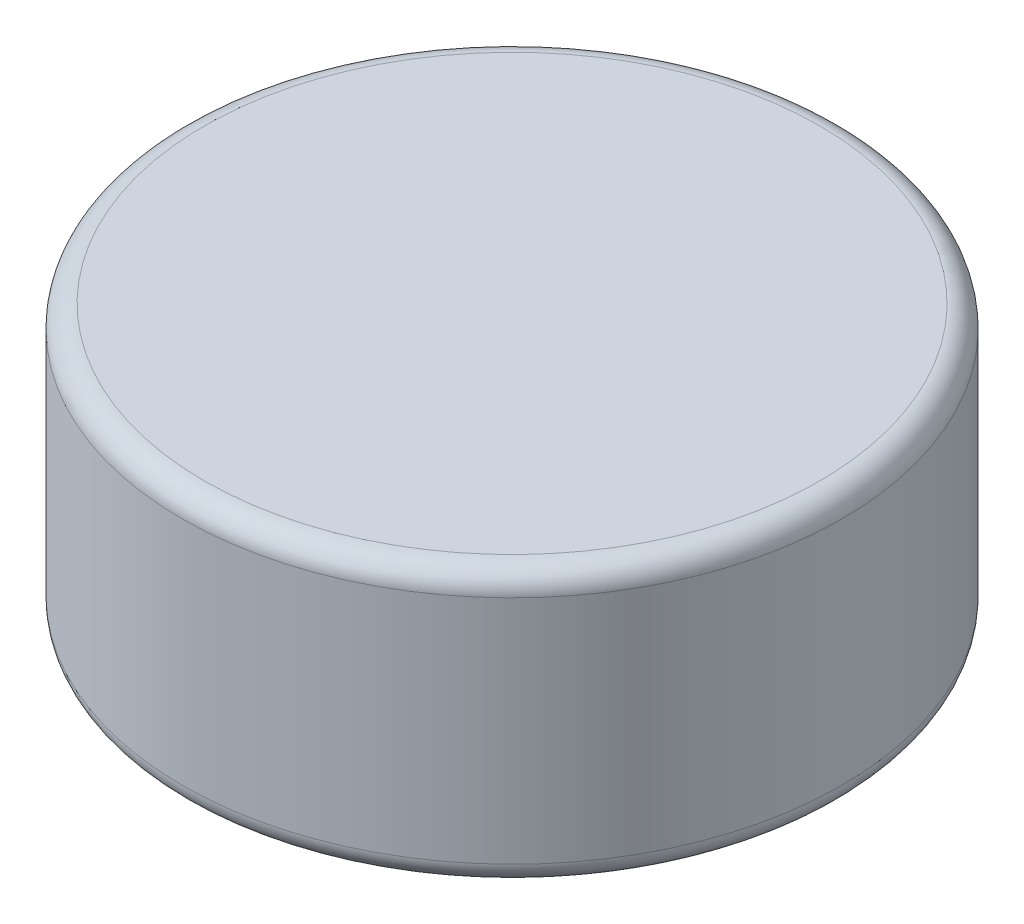
ISO-10303-21;
HEADER;
FILE_DESCRIPTION(('STEP AP214'),'2;1');
FILE_NAME('part.step','',(''),(''),'','','');
FILE_SCHEMA(('AUTOMOTIVE_DESIGN { 1 0 10303 214 1 1 1 1 }'));
ENDSEC;
DATA;
#1=APPLICATION_CONTEXT('core data for automotive mechanical design processes');
#2=APPLICATION_PROTOCOL_DEFINITION('international standard','automotive_design',2000,#1);
#3=PRODUCT_CONTEXT('',#1,'mechanical');
#4=PRODUCT('Part','Part','',(#3));
#5=PRODUCT_RELATED_PRODUCT_CATEGORY('part','',(#4));
#6=PRODUCT_DEFINITION_FORMATION('','',#4);
#7=PRODUCT_DEFINITION_CONTEXT('part definition',#1,'design');
#8=PRODUCT_DEFINITION('design','',#6,#7);
#9=PRODUCT_DEFINITION_SHAPE('','',#8);
#10=(LENGTH_UNIT() NAMED_UNIT(*) SI_UNIT(.MILLI.,.METRE.));
#11=(NAMED_UNIT(*) PLANE_ANGLE_UNIT() SI_UNIT($,.RADIAN.));
#12=(NAMED_UNIT(*) SI_UNIT($,.STERADIAN.) SOLID_ANGLE_UNIT());
#13=UNCERTAINTY_MEASURE_WITH_UNIT(LENGTH_MEASURE(1.E-05),#10,'distance_accuracy_value','');
#14=(GEOMETRIC_REPRESENTATION_CONTEXT(3) GLOBAL_UNCERTAINTY_ASSIGNED_CONTEXT((#13)) GLOBAL_UNIT_ASSIGNED_CONTEXT((#10,
#11,#12)) REPRESENTATION_CONTEXT('',''));
#15=CARTESIAN_POINT('',(0.,0.,0.));
#16=DIRECTION('',(0.,0.,1.));
#17=DIRECTION('',(1.,0.,0.));
#18=AXIS2_PLACEMENT_3D('',#15,#16,#17);
#19=CARTESIAN_POINT('',(0.,2.5,0.));
#20=DIRECTION('',(0.,-1.,0.));
#21=DIRECTION('',(0.,0.,-1.));
#22=AXIS2_PLACEMENT_3D('',#19,#20,#21);
#23=CYLINDRICAL_SURFACE('',#22,3.);
#24=CARTESIAN_POINT('',(0.,0.2,0.));
#25=DIRECTION('',(0.,1.,0.));
#26=DIRECTION('',(0.,0.,1.));
#27=AXIS2_PLACEMENT_3D('',#24,#25,#26);
#28=CIRCLE('',#27,3.);
#29=CARTESIAN_POINT('',(0.,0.2,3.));
#30=VERTEX_POINT('',#29);
#31=EDGE_CURVE('E44',#30,#30,#28,.T.);
#32=ORIENTED_EDGE('',*,*,#31,.T.);
#33=EDGE_LOOP('',(#32));
#34=FACE_BOUND('',#33,.T.);
#35=CARTESIAN_POINT('',(0.,2.3,0.));
#36=DIRECTION('',(0.,1.,0.));
#37=DIRECTION('',(0.,0.,1.));
#38=AXIS2_PLACEMENT_3D('',#35,#36,#37);
#39=CIRCLE('',#38,3.);
#40=CARTESIAN_POINT('',(0.,2.3,3.));
#41=VERTEX_POINT('',#40);
#42=EDGE_CURVE('E48',#41,#41,#39,.F.);
#43=ORIENTED_EDGE('',*,*,#42,.T.);
#44=EDGE_LOOP('',(#43));
#45=FACE_BOUND('',#44,.T.);
#46=ADVANCED_FACE('F33',(#34,#45),#23,.T.);
#47=CARTESIAN_POINT('',(0.,2.5,0.));
#48=DIRECTION('',(0.,1.,0.));
#49=DIRECTION('',(0.,0.,1.));
#50=AXIS2_PLACEMENT_3D('',#47,#48,#49);
#51=PLANE('',#50);
#52=CARTESIAN_POINT('',(0.,2.5,0.));
#53=DIRECTION('',(0.,1.,0.));
#54=DIRECTION('',(0.,0.,1.));
#55=AXIS2_PLACEMENT_3D('',#52,#53,#54);
#56=CIRCLE('',#55,2.8);
#57=CARTESIAN_POINT('',(0.,2.5,2.8));
#58=VERTEX_POINT('',#57);
#59=EDGE_CURVE('E10',#58,#58,#56,.T.);
#60=ORIENTED_EDGE('',*,*,#59,.T.);
#61=EDGE_LOOP('',(#60));
#62=FACE_BOUND('',#61,.T.);
#63=ADVANCED_FACE('F64',(#62),#51,.T.);
#64=CARTESIAN_POINT('',(0.,0.,0.));
#65=DIRECTION('',(0.,1.,0.));
#66=DIRECTION('',(0.,0.,1.));
#67=AXIS2_PLACEMENT_3D('',#64,#65,#66);
#68=PLANE('',#67);
#69=CARTESIAN_POINT('',(0.,0.,0.));
#70=DIRECTION('',(0.,1.,0.));
#71=DIRECTION('',(0.,0.,1.));
#72=AXIS2_PLACEMENT_3D('',#69,#70,#71);
#73=CIRCLE('',#72,2.8);
#74=CARTESIAN_POINT('',(0.,0.,2.8));
#75=VERTEX_POINT('',#74);
#76=EDGE_CURVE('E40',#75,#75,#73,.F.);
#77=ORIENTED_EDGE('',*,*,#76,.T.);
#78=EDGE_LOOP('',(#77));
#79=FACE_BOUND('',#78,.T.);
#80=ADVANCED_FACE('F61',(#79),#68,.F.);
#81=CARTESIAN_POINT('',(0.,0.2,0.));
#82=DIRECTION('',(0.,1.,0.));
#83=DIRECTION('',(0.,0.,1.));
#84=AXIS2_PLACEMENT_3D('',#81,#82,#83);
#85=TOROIDAL_SURFACE('',#84,2.8,0.2);
#86=ORIENTED_EDGE('',*,*,#76,.F.);
#87=EDGE_LOOP('',(#86));
#88=FACE_BOUND('',#87,.T.);
#89=ORIENTED_EDGE('',*,*,#31,.F.);
#90=EDGE_LOOP('',(#89));
#91=FACE_BOUND('',#90,.T.);
#92=ADVANCED_FACE('F57',(#88,#91),#85,.T.);
#93=CARTESIAN_POINT('',(0.,2.3,0.));
#94=DIRECTION('',(0.,1.,0.));
#95=DIRECTION('',(0.,0.,1.));
#96=AXIS2_PLACEMENT_3D('',#93,#94,#95);
#97=TOROIDAL_SURFACE('',#96,2.8,0.2);
#98=ORIENTED_EDGE('',*,*,#42,.F.);
#99=EDGE_LOOP('',(#98));
#100=FACE_BOUND('',#99,.T.);
#101=ORIENTED_EDGE('',*,*,#59,.F.);
#102=EDGE_LOOP('',(#101));
#103=FACE_BOUND('',#102,.T.);
#104=ADVANCED_FACE('F35',(#100,#103),#97,.T.);
#105=CLOSED_SHELL('',(#46,#63,#80,#92,#104));
#106=MANIFOLD_SOLID_BREP('B2',#105);
#107=ADVANCED_BREP_SHAPE_REPRESENTATION('',(#18,#106),#14);
#108=SHAPE_DEFINITION_REPRESENTATION(#9,#107);
ENDSEC;
END-ISO-10303-21;
